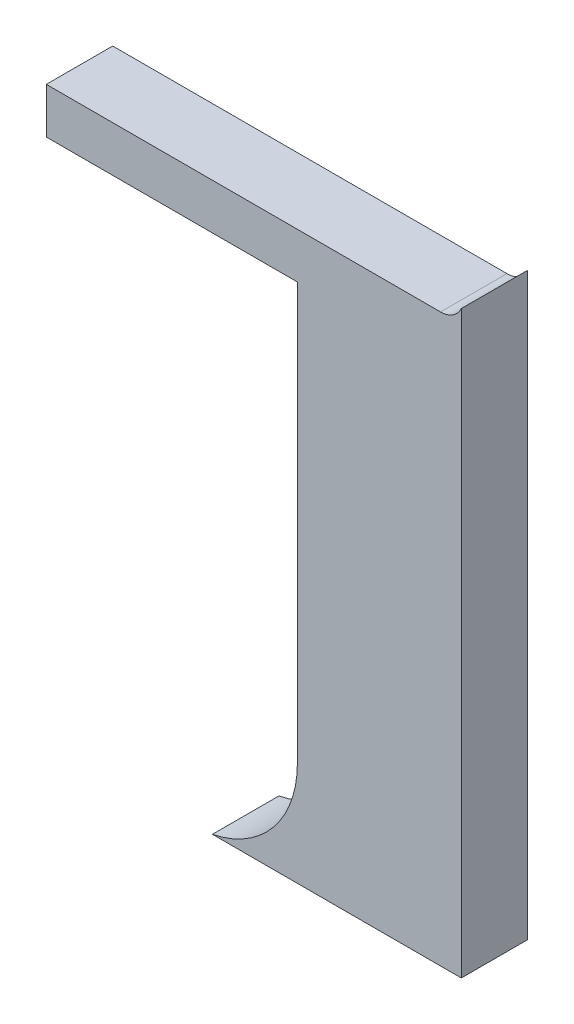
ISO-10303-21;
HEADER;
FILE_DESCRIPTION(('STEP AP214'),'2;1');
FILE_NAME('part.step','',(''),(''),'','','');
FILE_SCHEMA(('AUTOMOTIVE_DESIGN { 1 0 10303 214 1 1 1 1 }'));
ENDSEC;
DATA;
#1=APPLICATION_CONTEXT('core data for automotive mechanical design processes');
#2=APPLICATION_PROTOCOL_DEFINITION('international standard','automotive_design',2000,#1);
#3=PRODUCT_CONTEXT('',#1,'mechanical');
#4=PRODUCT('Part','Part','',(#3));
#5=PRODUCT_RELATED_PRODUCT_CATEGORY('part','',(#4));
#6=PRODUCT_DEFINITION_FORMATION('','',#4);
#7=PRODUCT_DEFINITION_CONTEXT('part definition',#1,'design');
#8=PRODUCT_DEFINITION('design','',#6,#7);
#9=PRODUCT_DEFINITION_SHAPE('','',#8);
#10=(LENGTH_UNIT() NAMED_UNIT(*) SI_UNIT(.MILLI.,.METRE.));
#11=(NAMED_UNIT(*) PLANE_ANGLE_UNIT() SI_UNIT($,.RADIAN.));
#12=(NAMED_UNIT(*) SI_UNIT($,.STERADIAN.) SOLID_ANGLE_UNIT());
#13=UNCERTAINTY_MEASURE_WITH_UNIT(LENGTH_MEASURE(1.E-05),#10,'distance_accuracy_value','');
#14=(GEOMETRIC_REPRESENTATION_CONTEXT(3) GLOBAL_UNCERTAINTY_ASSIGNED_CONTEXT((#13)) GLOBAL_UNIT_ASSIGNED_CONTEXT((#10,
#11,#12)) REPRESENTATION_CONTEXT('',''));
#15=CARTESIAN_POINT('',(0.,0.,0.));
#16=DIRECTION('',(0.,0.,1.));
#17=DIRECTION('',(1.,0.,0.));
#18=AXIS2_PLACEMENT_3D('',#15,#16,#17);
#19=CARTESIAN_POINT('',(67.0000000000001,-0.99999999999997,6.40000000000011));
#20=DIRECTION('',(0.,0.,-1.));
#21=DIRECTION('',(-1.,0.,0.));
#22=AXIS2_PLACEMENT_3D('',#19,#20,#21);
#23=CYLINDRICAL_SURFACE('',#22,2.20000000000001);
#24=CARTESIAN_POINT('',(67.0000000000001,-0.99999999999997,0.));
#25=DIRECTION('',(0.,0.,1.));
#26=DIRECTION('',(1.,0.,0.));
#27=AXIS2_PLACEMENT_3D('',#24,#25,#26);
#28=CIRCLE('',#27,2.20000000000001);
#29=CARTESIAN_POINT('',(67.0000000000001,-3.19999999999997,0.));
#30=VERTEX_POINT('',#29);
#31=CARTESIAN_POINT('',(69.0000000000001,-1.91651513899115,0.));
#32=VERTEX_POINT('',#31);
#33=EDGE_CURVE('E131',#30,#32,#28,.T.);
#34=ORIENTED_EDGE('',*,*,#33,.F.);
#35=DIRECTION('',(0.,0.,-1.));
#36=VECTOR('',#35,1.);
#37=CARTESIAN_POINT('',(67.0000000000001,-3.19999999999997,6.40000000000011));
#38=LINE('',#37,#36);
#39=CARTESIAN_POINT('',(67.0000000000001,-3.19999999999997,6.40000000000011));
#40=VERTEX_POINT('',#39);
#41=EDGE_CURVE('E11',#40,#30,#38,.T.);
#42=ORIENTED_EDGE('',*,*,#41,.F.);
#43=CARTESIAN_POINT('',(67.0000000000001,-0.99999999999997,6.40000000000011));
#44=DIRECTION('',(0.,0.,1.));
#45=DIRECTION('',(1.,0.,0.));
#46=AXIS2_PLACEMENT_3D('',#43,#44,#45);
#47=CIRCLE('',#46,2.20000000000001);
#48=CARTESIAN_POINT('',(69.0000000000001,-1.91651513899115,6.40000000000011));
#49=VERTEX_POINT('',#48);
#50=EDGE_CURVE('E150',#40,#49,#47,.T.);
#51=ORIENTED_EDGE('',*,*,#50,.T.);
#52=DIRECTION('',(0.,0.,-1.));
#53=VECTOR('',#52,1.);
#54=CARTESIAN_POINT('',(69.0000000000001,-1.91651513899115,6.40000000000011));
#55=LINE('',#54,#53);
#56=EDGE_CURVE('E51',#49,#32,#55,.T.);
#57=ORIENTED_EDGE('',*,*,#56,.T.);
#58=EDGE_LOOP('',(#34,#42,#51,#57));
#59=FACE_BOUND('',#58,.T.);
#60=ADVANCED_FACE('F35',(#59),#23,.F.);
#61=CARTESIAN_POINT('',(0.,-3.19999999999997,6.40000000000011));
#62=DIRECTION('',(0.,-1.,0.));
#63=DIRECTION('',(0.,0.,-1.));
#64=AXIS2_PLACEMENT_3D('',#61,#62,#63);
#65=PLANE('',#64);
#66=DIRECTION('',(-1.,0.,0.));
#67=VECTOR('',#66,1.);
#68=CARTESIAN_POINT('',(0.,-3.19999999999997,0.));
#69=LINE('',#68,#67);
#70=CARTESIAN_POINT('',(29.0000000000001,-3.19999999999997,0.));
#71=VERTEX_POINT('',#70);
#72=EDGE_CURVE('E133',#30,#71,#69,.T.);
#73=ORIENTED_EDGE('',*,*,#72,.T.);
#74=DIRECTION('',(0.,0.,-1.));
#75=VECTOR('',#74,1.);
#76=CARTESIAN_POINT('',(29.0000000000001,-3.19999999999997,6.40000000000011));
#77=LINE('',#76,#75);
#78=CARTESIAN_POINT('',(29.0000000000001,-3.19999999999997,6.40000000000011));
#79=VERTEX_POINT('',#78);
#80=EDGE_CURVE('E43',#79,#71,#77,.T.);
#81=ORIENTED_EDGE('',*,*,#80,.F.);
#82=DIRECTION('',(-1.,0.,0.));
#83=VECTOR('',#82,1.);
#84=CARTESIAN_POINT('',(0.,-3.19999999999997,6.40000000000011));
#85=LINE('',#84,#83);
#86=EDGE_CURVE('E174',#40,#79,#85,.T.);
#87=ORIENTED_EDGE('',*,*,#86,.F.);
#88=ORIENTED_EDGE('',*,*,#41,.T.);
#89=EDGE_LOOP('',(#73,#81,#87,#88));
#90=FACE_BOUND('',#89,.T.);
#91=ADVANCED_FACE('F189',(#90),#65,.F.);
#92=CARTESIAN_POINT('',(29.0000000000001,0.,6.40000000000011));
#93=DIRECTION('',(1.,0.,0.));
#94=DIRECTION('',(0.,0.,-1.));
#95=AXIS2_PLACEMENT_3D('',#92,#93,#94);
#96=PLANE('',#95);
#97=DIRECTION('',(0.,-1.,0.));
#98=VECTOR('',#97,1.);
#99=CARTESIAN_POINT('',(29.0000000000001,0.,0.));
#100=LINE('',#99,#98);
#101=CARTESIAN_POINT('',(29.0000000000001,-7.59999999999999,0.));
#102=VERTEX_POINT('',#101);
#103=EDGE_CURVE('E135',#71,#102,#100,.T.);
#104=ORIENTED_EDGE('',*,*,#103,.T.);
#105=DIRECTION('',(0.,0.,-1.));
#106=VECTOR('',#105,1.);
#107=CARTESIAN_POINT('',(29.0000000000001,-7.59999999999999,6.40000000000011));
#108=LINE('',#107,#106);
#109=CARTESIAN_POINT('',(29.0000000000001,-7.59999999999999,6.40000000000011));
#110=VERTEX_POINT('',#109);
#111=EDGE_CURVE('E156',#110,#102,#108,.T.);
#112=ORIENTED_EDGE('',*,*,#111,.F.);
#113=DIRECTION('',(0.,-1.,0.));
#114=VECTOR('',#113,1.);
#115=CARTESIAN_POINT('',(29.0000000000001,0.,6.40000000000011));
#116=LINE('',#115,#114);
#117=EDGE_CURVE('E164',#79,#110,#116,.T.);
#118=ORIENTED_EDGE('',*,*,#117,.F.);
#119=ORIENTED_EDGE('',*,*,#80,.T.);
#120=EDGE_LOOP('',(#104,#112,#118,#119));
#121=FACE_BOUND('',#120,.T.);
#122=ADVANCED_FACE('F162',(#121),#96,.F.);
#123=CARTESIAN_POINT('',(0.,-7.59999999999999,6.40000000000011));
#124=DIRECTION('',(0.,-1.,0.));
#125=DIRECTION('',(0.,0.,-1.));
#126=AXIS2_PLACEMENT_3D('',#123,#124,#125);
#127=PLANE('',#126);
#128=DIRECTION('',(-1.,0.,0.));
#129=VECTOR('',#128,1.);
#130=CARTESIAN_POINT('',(0.,-7.59999999999999,0.));
#131=LINE('',#130,#129);
#132=CARTESIAN_POINT('',(53.1999999999997,-7.59999999999999,0.));
#133=VERTEX_POINT('',#132);
#134=EDGE_CURVE('E138',#133,#102,#131,.T.);
#135=ORIENTED_EDGE('',*,*,#134,.F.);
#136=DIRECTION('',(0.,0.,-1.));
#137=VECTOR('',#136,1.);
#138=CARTESIAN_POINT('',(53.1999999999997,-7.59999999999999,6.40000000000011));
#139=LINE('',#138,#137);
#140=CARTESIAN_POINT('',(53.1999999999997,-7.59999999999999,6.40000000000011));
#141=VERTEX_POINT('',#140);
#142=EDGE_CURVE('E154',#141,#133,#139,.T.);
#143=ORIENTED_EDGE('',*,*,#142,.F.);
#144=DIRECTION('',(-1.,0.,0.));
#145=VECTOR('',#144,1.);
#146=CARTESIAN_POINT('',(0.,-7.59999999999999,6.40000000000011));
#147=LINE('',#146,#145);
#148=EDGE_CURVE('E126',#141,#110,#147,.T.);
#149=ORIENTED_EDGE('',*,*,#148,.T.);
#150=ORIENTED_EDGE('',*,*,#111,.T.);
#151=EDGE_LOOP('',(#135,#143,#149,#150));
#152=FACE_BOUND('',#151,.T.);
#153=ADVANCED_FACE('F172',(#152),#127,.T.);
#154=CARTESIAN_POINT('',(53.1999999999997,0.,6.40000000000011));
#155=DIRECTION('',(-1.,0.,0.));
#156=DIRECTION('',(0.,0.,1.));
#157=AXIS2_PLACEMENT_3D('',#154,#155,#156);
#158=PLANE('',#157);
#159=DIRECTION('',(0.,1.,0.));
#160=VECTOR('',#159,1.);
#161=CARTESIAN_POINT('',(53.1999999999997,0.,0.));
#162=LINE('',#161,#160);
#163=CARTESIAN_POINT('',(53.1999999999997,-47.8,0.));
#164=VERTEX_POINT('',#163);
#165=EDGE_CURVE('E141',#164,#133,#162,.T.);
#166=ORIENTED_EDGE('',*,*,#165,.F.);
#167=DIRECTION('',(0.,0.,-1.));
#168=VECTOR('',#167,1.);
#169=CARTESIAN_POINT('',(53.1999999999997,-47.8,6.40000000000011));
#170=LINE('',#169,#168);
#171=CARTESIAN_POINT('',(53.1999999999997,-47.8,6.40000000000011));
#172=VERTEX_POINT('',#171);
#173=EDGE_CURVE('E111',#172,#164,#170,.T.);
#174=ORIENTED_EDGE('',*,*,#173,.F.);
#175=DIRECTION('',(0.,1.,0.));
#176=VECTOR('',#175,1.);
#177=CARTESIAN_POINT('',(53.1999999999997,0.,6.40000000000011));
#178=LINE('',#177,#176);
#179=EDGE_CURVE('E124',#172,#141,#178,.T.);
#180=ORIENTED_EDGE('',*,*,#179,.T.);
#181=ORIENTED_EDGE('',*,*,#142,.T.);
#182=EDGE_LOOP('',(#166,#174,#180,#181));
#183=FACE_BOUND('',#182,.T.);
#184=ADVANCED_FACE('F200',(#183),#158,.T.);
#185=CARTESIAN_POINT('',(42.9999999999997,-47.8,6.40000000000011));
#186=DIRECTION('',(0.,0.,-1.));
#187=DIRECTION('',(-1.,0.,0.));
#188=AXIS2_PLACEMENT_3D('',#185,#186,#187);
#189=CYLINDRICAL_SURFACE('',#188,10.2);
#190=CARTESIAN_POINT('',(42.9999999999997,-47.8,0.));
#191=DIRECTION('',(0.,0.,1.));
#192=DIRECTION('',(1.,0.,0.));
#193=AXIS2_PLACEMENT_3D('',#190,#191,#192);
#194=CIRCLE('',#193,10.2);
#195=CARTESIAN_POINT('',(45.0099751242239,-57.8,0.));
#196=VERTEX_POINT('',#195);
#197=EDGE_CURVE('E108',#196,#164,#194,.T.);
#198=ORIENTED_EDGE('',*,*,#197,.F.);
#199=DIRECTION('',(0.,0.,-1.));
#200=VECTOR('',#199,1.);
#201=CARTESIAN_POINT('',(45.0099751242239,-57.8,6.40000000000011));
#202=LINE('',#201,#200);
#203=CARTESIAN_POINT('',(45.0099751242239,-57.8,6.40000000000011));
#204=VERTEX_POINT('',#203);
#205=EDGE_CURVE('E102',#204,#196,#202,.T.);
#206=ORIENTED_EDGE('',*,*,#205,.F.);
#207=CARTESIAN_POINT('',(42.9999999999997,-47.8,6.40000000000011));
#208=DIRECTION('',(0.,0.,1.));
#209=DIRECTION('',(1.,0.,0.));
#210=AXIS2_PLACEMENT_3D('',#207,#208,#209);
#211=CIRCLE('',#210,10.2);
#212=EDGE_CURVE('E106',#204,#172,#211,.T.);
#213=ORIENTED_EDGE('',*,*,#212,.T.);
#214=ORIENTED_EDGE('',*,*,#173,.T.);
#215=EDGE_LOOP('',(#198,#206,#213,#214));
#216=FACE_BOUND('',#215,.T.);
#217=ADVANCED_FACE('F104',(#216),#189,.F.);
#218=CARTESIAN_POINT('',(0.,-57.8,6.40000000000011));
#219=DIRECTION('',(0.,1.,0.));
#220=DIRECTION('',(0.,0.,1.));
#221=AXIS2_PLACEMENT_3D('',#218,#219,#220);
#222=PLANE('',#221);
#223=DIRECTION('',(1.,0.,0.));
#224=VECTOR('',#223,1.);
#225=CARTESIAN_POINT('',(0.,-57.8,0.));
#226=LINE('',#225,#224);
#227=CARTESIAN_POINT('',(69.0000000000001,-57.8,0.));
#228=VERTEX_POINT('',#227);
#229=EDGE_CURVE('E145',#196,#228,#226,.T.);
#230=ORIENTED_EDGE('',*,*,#229,.T.);
#231=DIRECTION('',(0.,0.,-1.));
#232=VECTOR('',#231,1.);
#233=CARTESIAN_POINT('',(69.0000000000001,-57.8,6.40000000000011));
#234=LINE('',#233,#232);
#235=CARTESIAN_POINT('',(69.0000000000001,-57.8,6.40000000000011));
#236=VERTEX_POINT('',#235);
#237=EDGE_CURVE('E77',#236,#228,#234,.T.);
#238=ORIENTED_EDGE('',*,*,#237,.F.);
#239=DIRECTION('',(1.,0.,0.));
#240=VECTOR('',#239,1.);
#241=CARTESIAN_POINT('',(0.,-57.8,6.40000000000011));
#242=LINE('',#241,#240);
#243=EDGE_CURVE('E113',#204,#236,#242,.T.);
#244=ORIENTED_EDGE('',*,*,#243,.F.);
#245=ORIENTED_EDGE('',*,*,#205,.T.);
#246=EDGE_LOOP('',(#230,#238,#244,#245));
#247=FACE_BOUND('',#246,.T.);
#248=ADVANCED_FACE('F114',(#247),#222,.F.);
#249=CARTESIAN_POINT('',(69.0000000000001,0.,6.40000000000011));
#250=DIRECTION('',(1.,0.,0.));
#251=DIRECTION('',(0.,0.,-1.));
#252=AXIS2_PLACEMENT_3D('',#249,#250,#251);
#253=PLANE('',#252);
#254=DIRECTION('',(0.,-1.,0.));
#255=VECTOR('',#254,1.);
#256=CARTESIAN_POINT('',(69.0000000000001,0.,0.));
#257=LINE('',#256,#255);
#258=EDGE_CURVE('E147',#32,#228,#257,.T.);
#259=ORIENTED_EDGE('',*,*,#258,.F.);
#260=ORIENTED_EDGE('',*,*,#56,.F.);
#261=DIRECTION('',(0.,-1.,0.));
#262=VECTOR('',#261,1.);
#263=CARTESIAN_POINT('',(69.0000000000001,0.,6.40000000000011));
#264=LINE('',#263,#262);
#265=EDGE_CURVE('E117',#49,#236,#264,.T.);
#266=ORIENTED_EDGE('',*,*,#265,.T.);
#267=ORIENTED_EDGE('',*,*,#237,.T.);
#268=EDGE_LOOP('',(#259,#260,#266,#267));
#269=FACE_BOUND('',#268,.T.);
#270=ADVANCED_FACE('F178',(#269),#253,.T.);
#271=CARTESIAN_POINT('',(0.,0.,6.40000000000011));
#272=DIRECTION('',(0.,0.,1.));
#273=DIRECTION('',(1.,0.,0.));
#274=AXIS2_PLACEMENT_3D('',#271,#272,#273);
#275=PLANE('',#274);
#276=ORIENTED_EDGE('',*,*,#50,.F.);
#277=ORIENTED_EDGE('',*,*,#86,.T.);
#278=ORIENTED_EDGE('',*,*,#117,.T.);
#279=ORIENTED_EDGE('',*,*,#148,.F.);
#280=ORIENTED_EDGE('',*,*,#179,.F.);
#281=ORIENTED_EDGE('',*,*,#212,.F.);
#282=ORIENTED_EDGE('',*,*,#243,.T.);
#283=ORIENTED_EDGE('',*,*,#265,.F.);
#284=EDGE_LOOP('',(#276,#277,#278,#279,#280,#281,#282,#283));
#285=FACE_BOUND('',#284,.T.);
#286=ADVANCED_FACE('F121',(#285),#275,.T.);
#287=CARTESIAN_POINT('',(0.,0.,0.));
#288=DIRECTION('',(0.,0.,1.));
#289=DIRECTION('',(1.,0.,0.));
#290=AXIS2_PLACEMENT_3D('',#287,#288,#289);
#291=PLANE('',#290);
#292=ORIENTED_EDGE('',*,*,#33,.T.);
#293=ORIENTED_EDGE('',*,*,#258,.T.);
#294=ORIENTED_EDGE('',*,*,#229,.F.);
#295=ORIENTED_EDGE('',*,*,#197,.T.);
#296=ORIENTED_EDGE('',*,*,#165,.T.);
#297=ORIENTED_EDGE('',*,*,#134,.T.);
#298=ORIENTED_EDGE('',*,*,#103,.F.);
#299=ORIENTED_EDGE('',*,*,#72,.F.);
#300=EDGE_LOOP('',(#292,#293,#294,#295,#296,#297,#298,#299));
#301=FACE_BOUND('',#300,.T.);
#302=ADVANCED_FACE('F168',(#301),#291,.F.);
#303=CLOSED_SHELL('',(#60,#91,#122,#153,#184,#217,#248,#270,#286,#302));
#304=MANIFOLD_SOLID_BREP('B2',#303);
#305=ADVANCED_BREP_SHAPE_REPRESENTATION('',(#18,#304),#14);
#306=SHAPE_DEFINITION_REPRESENTATION(#9,#305);
ENDSEC;
END-ISO-10303-21;
